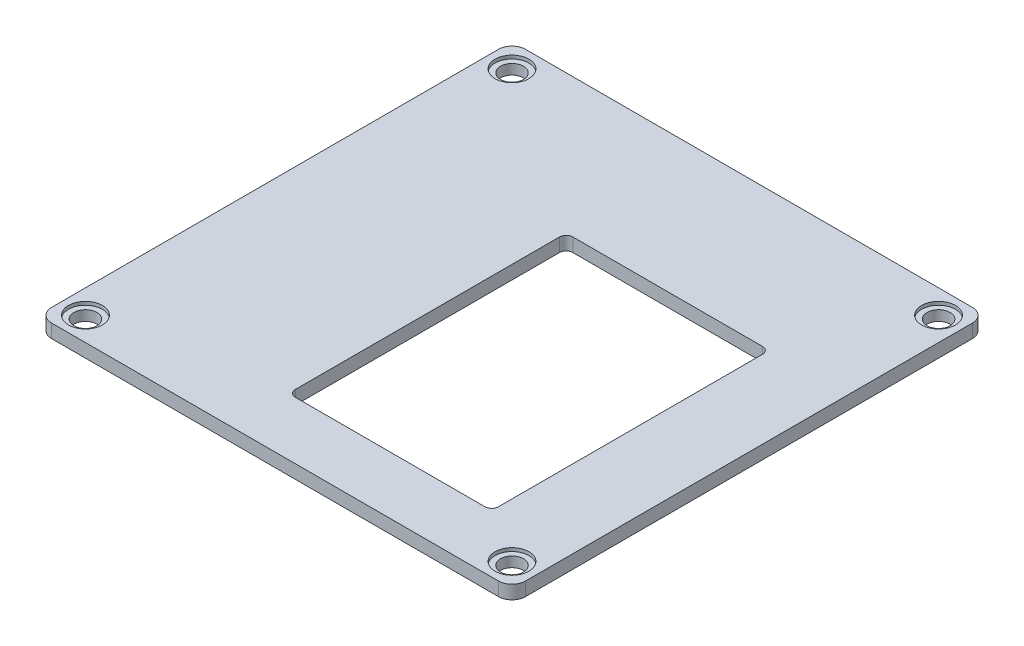
ISO-10303-21;
HEADER;
FILE_DESCRIPTION(('STEP AP214'),'2;1');
FILE_NAME('part.step','',(''),(''),'','','');
FILE_SCHEMA(('AUTOMOTIVE_DESIGN { 1 0 10303 214 1 1 1 1 }'));
ENDSEC;
DATA;
#1=APPLICATION_CONTEXT('core data for automotive mechanical design processes');
#2=APPLICATION_PROTOCOL_DEFINITION('international standard','automotive_design',2000,#1);
#3=PRODUCT_CONTEXT('',#1,'mechanical');
#4=PRODUCT('Part','Part','',(#3));
#5=PRODUCT_RELATED_PRODUCT_CATEGORY('part','',(#4));
#6=PRODUCT_DEFINITION_FORMATION('','',#4);
#7=PRODUCT_DEFINITION_CONTEXT('part definition',#1,'design');
#8=PRODUCT_DEFINITION('design','',#6,#7);
#9=PRODUCT_DEFINITION_SHAPE('','',#8);
#10=(LENGTH_UNIT() NAMED_UNIT(*) SI_UNIT(.MILLI.,.METRE.));
#11=(NAMED_UNIT(*) PLANE_ANGLE_UNIT() SI_UNIT($,.RADIAN.));
#12=(NAMED_UNIT(*) SI_UNIT($,.STERADIAN.) SOLID_ANGLE_UNIT());
#13=UNCERTAINTY_MEASURE_WITH_UNIT(LENGTH_MEASURE(1.E-05),#10,'distance_accuracy_value','');
#14=(GEOMETRIC_REPRESENTATION_CONTEXT(3) GLOBAL_UNCERTAINTY_ASSIGNED_CONTEXT((#13)) GLOBAL_UNIT_ASSIGNED_CONTEXT((#10,
#11,#12)) REPRESENTATION_CONTEXT('',''));
#15=CARTESIAN_POINT('',(0.,0.,0.));
#16=DIRECTION('',(0.,0.,1.));
#17=DIRECTION('',(1.,0.,0.));
#18=AXIS2_PLACEMENT_3D('',#15,#16,#17);
#19=CARTESIAN_POINT('',(28.,2.,28.));
#20=DIRECTION('',(0.,-1.,0.));
#21=DIRECTION('',(0.,0.,-1.));
#22=AXIS2_PLACEMENT_3D('',#19,#20,#21);
#23=CYLINDRICAL_SURFACE('',#22,1.7);
#24=CARTESIAN_POINT('',(28.,0.,28.));
#25=DIRECTION('',(0.,1.,0.));
#26=DIRECTION('',(0.,0.,1.));
#27=AXIS2_PLACEMENT_3D('',#24,#25,#26);
#28=CIRCLE('',#27,1.7);
#29=CARTESIAN_POINT('',(28.,0.,29.7));
#30=VERTEX_POINT('',#29);
#31=EDGE_CURVE('E191',#30,#30,#28,.T.);
#32=ORIENTED_EDGE('',*,*,#31,.F.);
#33=EDGE_LOOP('',(#32));
#34=FACE_BOUND('',#33,.T.);
#35=CARTESIAN_POINT('',(28.,1.5,28.));
#36=DIRECTION('',(0.,1.,0.));
#37=DIRECTION('',(0.,0.,1.));
#38=AXIS2_PLACEMENT_3D('',#35,#36,#37);
#39=CIRCLE('',#38,1.7);
#40=CARTESIAN_POINT('',(28.,1.5,29.7));
#41=VERTEX_POINT('',#40);
#42=EDGE_CURVE('E658',#41,#41,#39,.F.);
#43=ORIENTED_EDGE('',*,*,#42,.F.);
#44=EDGE_LOOP('',(#43));
#45=FACE_BOUND('',#44,.T.);
#46=ADVANCED_FACE('F39',(#34,#45),#23,.F.);
#47=CARTESIAN_POINT('',(28.,2.,-35.));
#48=DIRECTION('',(0.,-1.,0.));
#49=DIRECTION('',(0.,0.,-1.));
#50=AXIS2_PLACEMENT_3D('',#47,#48,#49);
#51=CYLINDRICAL_SURFACE('',#50,1.7);
#52=CARTESIAN_POINT('',(28.,0.,-35.));
#53=DIRECTION('',(0.,1.,0.));
#54=DIRECTION('',(0.,0.,1.));
#55=AXIS2_PLACEMENT_3D('',#52,#53,#54);
#56=CIRCLE('',#55,1.7);
#57=CARTESIAN_POINT('',(28.,0.,-33.3));
#58=VERTEX_POINT('',#57);
#59=EDGE_CURVE('E338',#58,#58,#56,.T.);
#60=ORIENTED_EDGE('',*,*,#59,.F.);
#61=EDGE_LOOP('',(#60));
#62=FACE_BOUND('',#61,.T.);
#63=CARTESIAN_POINT('',(28.,1.5,-35.));
#64=DIRECTION('',(0.,1.,0.));
#65=DIRECTION('',(0.,0.,1.));
#66=AXIS2_PLACEMENT_3D('',#63,#64,#65);
#67=CIRCLE('',#66,1.7);
#68=CARTESIAN_POINT('',(28.,1.5,-33.3));
#69=VERTEX_POINT('',#68);
#70=EDGE_CURVE('E645',#69,#69,#67,.F.);
#71=ORIENTED_EDGE('',*,*,#70,.F.);
#72=EDGE_LOOP('',(#71));
#73=FACE_BOUND('',#72,.T.);
#74=ADVANCED_FACE('F391',(#62,#73),#51,.F.);
#75=CARTESIAN_POINT('',(-35.,2.,28.));
#76=DIRECTION('',(0.,-1.,0.));
#77=DIRECTION('',(0.,0.,-1.));
#78=AXIS2_PLACEMENT_3D('',#75,#76,#77);
#79=CYLINDRICAL_SURFACE('',#78,1.7);
#80=CARTESIAN_POINT('',(-35.,0.,28.));
#81=DIRECTION('',(0.,1.,0.));
#82=DIRECTION('',(0.,0.,-1.));
#83=AXIS2_PLACEMENT_3D('',#80,#81,#82);
#84=CIRCLE('',#83,1.7);
#85=CARTESIAN_POINT('',(-35.,0.,26.3));
#86=VERTEX_POINT('',#85);
#87=EDGE_CURVE('E334',#86,#86,#84,.T.);
#88=ORIENTED_EDGE('',*,*,#87,.F.);
#89=EDGE_LOOP('',(#88));
#90=FACE_BOUND('',#89,.T.);
#91=CARTESIAN_POINT('',(-35.,1.5,28.));
#92=DIRECTION('',(0.,1.,0.));
#93=DIRECTION('',(0.,0.,1.));
#94=AXIS2_PLACEMENT_3D('',#91,#92,#93);
#95=CIRCLE('',#94,1.7);
#96=CARTESIAN_POINT('',(-35.,1.5,29.7));
#97=VERTEX_POINT('',#96);
#98=EDGE_CURVE('E615',#97,#97,#95,.F.);
#99=ORIENTED_EDGE('',*,*,#98,.F.);
#100=EDGE_LOOP('',(#99));
#101=FACE_BOUND('',#100,.T.);
#102=ADVANCED_FACE('F397',(#90,#101),#79,.F.);
#103=CARTESIAN_POINT('',(-35.,2.,-35.));
#104=DIRECTION('',(0.,-1.,0.));
#105=DIRECTION('',(0.,0.,-1.));
#106=AXIS2_PLACEMENT_3D('',#103,#104,#105);
#107=CYLINDRICAL_SURFACE('',#106,1.7);
#108=CARTESIAN_POINT('',(-35.,0.,-35.));
#109=DIRECTION('',(0.,1.,0.));
#110=DIRECTION('',(0.,0.,-1.));
#111=AXIS2_PLACEMENT_3D('',#108,#109,#110);
#112=CIRCLE('',#111,1.7);
#113=CARTESIAN_POINT('',(-35.,0.,-36.7));
#114=VERTEX_POINT('',#113);
#115=EDGE_CURVE('E324',#114,#114,#112,.T.);
#116=ORIENTED_EDGE('',*,*,#115,.F.);
#117=EDGE_LOOP('',(#116));
#118=FACE_BOUND('',#117,.T.);
#119=CARTESIAN_POINT('',(-35.,1.5,-35.));
#120=DIRECTION('',(0.,1.,0.));
#121=DIRECTION('',(0.,0.,1.));
#122=AXIS2_PLACEMENT_3D('',#119,#120,#121);
#123=CIRCLE('',#122,1.7);
#124=CARTESIAN_POINT('',(-35.,1.5,-33.3));
#125=VERTEX_POINT('',#124);
#126=EDGE_CURVE('E630',#125,#125,#123,.F.);
#127=ORIENTED_EDGE('',*,*,#126,.F.);
#128=EDGE_LOOP('',(#127));
#129=FACE_BOUND('',#128,.T.);
#130=ADVANCED_FACE('F406',(#118,#129),#107,.F.);
#131=CARTESIAN_POINT('',(0.,2.,0.));
#132=DIRECTION('',(0.,1.,0.));
#133=DIRECTION('',(0.,0.,1.));
#134=AXIS2_PLACEMENT_3D('',#131,#132,#133);
#135=PLANE('',#134);
#136=CARTESIAN_POINT('',(-35.,2.,28.));
#137=DIRECTION('',(0.,1.,0.));
#138=DIRECTION('',(0.,0.,1.));
#139=AXIS2_PLACEMENT_3D('',#136,#137,#138);
#140=CIRCLE('',#139,2.5);
#141=CARTESIAN_POINT('',(-35.,2.,30.5));
#142=VERTEX_POINT('',#141);
#143=EDGE_CURVE('E618',#142,#142,#140,.T.);
#144=ORIENTED_EDGE('',*,*,#143,.F.);
#145=EDGE_LOOP('',(#144));
#146=FACE_BOUND('',#145,.T.);
#147=CARTESIAN_POINT('',(28.,2.,28.));
#148=DIRECTION('',(0.,1.,0.));
#149=DIRECTION('',(0.,0.,1.));
#150=AXIS2_PLACEMENT_3D('',#147,#148,#149);
#151=CIRCLE('',#150,2.5);
#152=CARTESIAN_POINT('',(28.,2.,30.5));
#153=VERTEX_POINT('',#152);
#154=EDGE_CURVE('E623',#153,#153,#151,.T.);
#155=ORIENTED_EDGE('',*,*,#154,.F.);
#156=EDGE_LOOP('',(#155));
#157=FACE_BOUND('',#156,.T.);
#158=CARTESIAN_POINT('',(28.,2.,-35.));
#159=DIRECTION('',(0.,1.,0.));
#160=DIRECTION('',(0.,0.,1.));
#161=AXIS2_PLACEMENT_3D('',#158,#159,#160);
#162=CIRCLE('',#161,2.5);
#163=CARTESIAN_POINT('',(28.,2.,-32.5));
#164=VERTEX_POINT('',#163);
#165=EDGE_CURVE('E651',#164,#164,#162,.T.);
#166=ORIENTED_EDGE('',*,*,#165,.F.);
#167=EDGE_LOOP('',(#166));
#168=FACE_BOUND('',#167,.T.);
#169=CARTESIAN_POINT('',(-35.,2.,-35.));
#170=DIRECTION('',(0.,1.,0.));
#171=DIRECTION('',(0.,0.,1.));
#172=AXIS2_PLACEMENT_3D('',#169,#170,#171);
#173=CIRCLE('',#172,2.5);
#174=CARTESIAN_POINT('',(-35.,2.,-32.5));
#175=VERTEX_POINT('',#174);
#176=EDGE_CURVE('E314',#175,#175,#173,.T.);
#177=ORIENTED_EDGE('',*,*,#176,.F.);
#178=EDGE_LOOP('',(#177));
#179=FACE_BOUND('',#178,.T.);
#180=DIRECTION('',(0.,0.,1.));
#181=VECTOR('',#180,1.);
#182=CARTESIAN_POINT('',(-38.5,2.,-38.5));
#183=LINE('',#182,#181);
#184=CARTESIAN_POINT('',(-38.5,2.,-36.5));
#185=VERTEX_POINT('',#184);
#186=CARTESIAN_POINT('',(-38.5,2.,29.5));
#187=VERTEX_POINT('',#186);
#188=EDGE_CURVE('E198',#185,#187,#183,.T.);
#189=ORIENTED_EDGE('',*,*,#188,.T.);
#190=CARTESIAN_POINT('',(-36.5,2.,29.5));
#191=DIRECTION('',(0.,1.,0.));
#192=DIRECTION('',(0.,0.,1.));
#193=AXIS2_PLACEMENT_3D('',#190,#191,#192);
#194=CIRCLE('',#193,2.);
#195=CARTESIAN_POINT('',(-36.5,2.,31.5));
#196=VERTEX_POINT('',#195);
#197=EDGE_CURVE('E223',#187,#196,#194,.T.);
#198=ORIENTED_EDGE('',*,*,#197,.T.);
#199=DIRECTION('',(1.,0.,0.));
#200=VECTOR('',#199,1.);
#201=CARTESIAN_POINT('',(-38.5,2.,31.5));
#202=LINE('',#201,#200);
#203=CARTESIAN_POINT('',(29.5,2.,31.5));
#204=VERTEX_POINT('',#203);
#205=EDGE_CURVE('E174',#196,#204,#202,.T.);
#206=ORIENTED_EDGE('',*,*,#205,.T.);
#207=CARTESIAN_POINT('',(29.5,2.,29.5));
#208=DIRECTION('',(0.,1.,0.));
#209=DIRECTION('',(0.,0.,1.));
#210=AXIS2_PLACEMENT_3D('',#207,#208,#209);
#211=CIRCLE('',#210,2.);
#212=CARTESIAN_POINT('',(31.5,2.,29.5));
#213=VERTEX_POINT('',#212);
#214=EDGE_CURVE('E220',#204,#213,#211,.T.);
#215=ORIENTED_EDGE('',*,*,#214,.T.);
#216=DIRECTION('',(0.,0.,-1.));
#217=VECTOR('',#216,1.);
#218=CARTESIAN_POINT('',(31.5,2.,-38.5));
#219=LINE('',#218,#217);
#220=CARTESIAN_POINT('',(31.5,2.,-36.5));
#221=VERTEX_POINT('',#220);
#222=EDGE_CURVE('E350',#213,#221,#219,.T.);
#223=ORIENTED_EDGE('',*,*,#222,.T.);
#224=CARTESIAN_POINT('',(29.5,2.,-36.5));
#225=DIRECTION('',(0.,1.,0.));
#226=DIRECTION('',(0.,0.,1.));
#227=AXIS2_PLACEMENT_3D('',#224,#225,#226);
#228=CIRCLE('',#227,2.);
#229=CARTESIAN_POINT('',(29.5,2.,-38.5));
#230=VERTEX_POINT('',#229);
#231=EDGE_CURVE('E217',#221,#230,#228,.T.);
#232=ORIENTED_EDGE('',*,*,#231,.T.);
#233=DIRECTION('',(-1.,0.,0.));
#234=VECTOR('',#233,1.);
#235=CARTESIAN_POINT('',(-38.5,2.,-38.5));
#236=LINE('',#235,#234);
#237=CARTESIAN_POINT('',(-36.5,2.,-38.5));
#238=VERTEX_POINT('',#237);
#239=EDGE_CURVE('E200',#230,#238,#236,.T.);
#240=ORIENTED_EDGE('',*,*,#239,.T.);
#241=CARTESIAN_POINT('',(-36.5,2.,-36.5));
#242=DIRECTION('',(0.,1.,0.));
#243=DIRECTION('',(0.,0.,1.));
#244=AXIS2_PLACEMENT_3D('',#241,#242,#243);
#245=CIRCLE('',#244,2.);
#246=EDGE_CURVE('E214',#238,#185,#245,.T.);
#247=ORIENTED_EDGE('',*,*,#246,.T.);
#248=EDGE_LOOP('',(#189,#198,#206,#215,#223,#232,#240,#247));
#249=FACE_BOUND('',#248,.T.);
#250=DIRECTION('',(1.,0.,0.));
#251=VECTOR('',#250,1.);
#252=CARTESIAN_POINT('',(-10.,2.,23.));
#253=LINE('',#252,#251);
#254=CARTESIAN_POINT('',(-9.,2.,23.));
#255=VERTEX_POINT('',#254);
#256=CARTESIAN_POINT('',(19.,2.,23.));
#257=VERTEX_POINT('',#256);
#258=EDGE_CURVE('E305',#255,#257,#253,.T.);
#259=ORIENTED_EDGE('',*,*,#258,.F.);
#260=CARTESIAN_POINT('',(-9.,2.,22.));
#261=DIRECTION('',(0.,1.,0.));
#262=DIRECTION('',(0.,0.,1.));
#263=AXIS2_PLACEMENT_3D('',#260,#261,#262);
#264=CIRCLE('',#263,1.);
#265=CARTESIAN_POINT('',(-10.,2.,22.));
#266=VERTEX_POINT('',#265);
#267=EDGE_CURVE('E11',#255,#266,#264,.F.);
#268=ORIENTED_EDGE('',*,*,#267,.T.);
#269=DIRECTION('',(0.,0.,1.));
#270=VECTOR('',#269,1.);
#271=CARTESIAN_POINT('',(-10.,2.,-18.));
#272=LINE('',#271,#270);
#273=CARTESIAN_POINT('',(-10.,2.,-17.));
#274=VERTEX_POINT('',#273);
#275=EDGE_CURVE('E302',#274,#266,#272,.T.);
#276=ORIENTED_EDGE('',*,*,#275,.F.);
#277=CARTESIAN_POINT('',(-9.00000000000001,2.,-17.));
#278=DIRECTION('',(0.,1.,0.));
#279=DIRECTION('',(0.,0.,1.));
#280=AXIS2_PLACEMENT_3D('',#277,#278,#279);
#281=CIRCLE('',#280,1.);
#282=CARTESIAN_POINT('',(-9.00000000000001,2.,-18.));
#283=VERTEX_POINT('',#282);
#284=EDGE_CURVE('E282',#274,#283,#281,.F.);
#285=ORIENTED_EDGE('',*,*,#284,.T.);
#286=DIRECTION('',(-1.,0.,0.));
#287=VECTOR('',#286,1.);
#288=CARTESIAN_POINT('',(-10.,2.,-18.));
#289=LINE('',#288,#287);
#290=CARTESIAN_POINT('',(19.,2.,-18.));
#291=VERTEX_POINT('',#290);
#292=EDGE_CURVE('E320',#291,#283,#289,.T.);
#293=ORIENTED_EDGE('',*,*,#292,.F.);
#294=CARTESIAN_POINT('',(19.,2.,-17.));
#295=DIRECTION('',(0.,1.,0.));
#296=DIRECTION('',(0.,0.,1.));
#297=AXIS2_PLACEMENT_3D('',#294,#295,#296);
#298=CIRCLE('',#297,1.);
#299=CARTESIAN_POINT('',(20.,2.,-17.));
#300=VERTEX_POINT('',#299);
#301=EDGE_CURVE('E270',#291,#300,#298,.F.);
#302=ORIENTED_EDGE('',*,*,#301,.T.);
#303=DIRECTION('',(0.,0.,-1.));
#304=VECTOR('',#303,1.);
#305=CARTESIAN_POINT('',(20.,2.,-18.));
#306=LINE('',#305,#304);
#307=CARTESIAN_POINT('',(20.,2.,22.));
#308=VERTEX_POINT('',#307);
#309=EDGE_CURVE('E310',#308,#300,#306,.T.);
#310=ORIENTED_EDGE('',*,*,#309,.F.);
#311=CARTESIAN_POINT('',(19.,2.,22.));
#312=DIRECTION('',(0.,1.,0.));
#313=DIRECTION('',(0.,0.,1.));
#314=AXIS2_PLACEMENT_3D('',#311,#312,#313);
#315=CIRCLE('',#314,1.);
#316=EDGE_CURVE('E276',#308,#257,#315,.F.);
#317=ORIENTED_EDGE('',*,*,#316,.T.);
#318=EDGE_LOOP('',(#259,#268,#276,#285,#293,#302,#310,#317));
#319=FACE_BOUND('',#318,.T.);
#320=ADVANCED_FACE('F358',(#146,#157,#168,#179,#249,#319),#135,.T.);
#321=CARTESIAN_POINT('',(0.,0.,0.));
#322=DIRECTION('',(0.,1.,0.));
#323=DIRECTION('',(0.,0.,1.));
#324=AXIS2_PLACEMENT_3D('',#321,#322,#323);
#325=PLANE('',#324);
#326=ORIENTED_EDGE('',*,*,#115,.T.);
#327=EDGE_LOOP('',(#326));
#328=FACE_BOUND('',#327,.T.);
#329=ORIENTED_EDGE('',*,*,#87,.T.);
#330=EDGE_LOOP('',(#329));
#331=FACE_BOUND('',#330,.T.);
#332=ORIENTED_EDGE('',*,*,#59,.T.);
#333=EDGE_LOOP('',(#332));
#334=FACE_BOUND('',#333,.T.);
#335=ORIENTED_EDGE('',*,*,#31,.T.);
#336=EDGE_LOOP('',(#335));
#337=FACE_BOUND('',#336,.T.);
#338=DIRECTION('',(1.,0.,0.));
#339=VECTOR('',#338,1.);
#340=CARTESIAN_POINT('',(-38.5,0.,31.5));
#341=LINE('',#340,#339);
#342=CARTESIAN_POINT('',(-36.5,0.,31.5));
#343=VERTEX_POINT('',#342);
#344=CARTESIAN_POINT('',(29.5,0.,31.5));
#345=VERTEX_POINT('',#344);
#346=EDGE_CURVE('E171',#343,#345,#341,.T.);
#347=ORIENTED_EDGE('',*,*,#346,.F.);
#348=CARTESIAN_POINT('',(-36.5,0.,29.5));
#349=DIRECTION('',(0.,1.,0.));
#350=DIRECTION('',(0.,0.,1.));
#351=AXIS2_PLACEMENT_3D('',#348,#349,#350);
#352=CIRCLE('',#351,2.);
#353=CARTESIAN_POINT('',(-38.5,0.,29.5));
#354=VERTEX_POINT('',#353);
#355=EDGE_CURVE('E153',#343,#354,#352,.F.);
#356=ORIENTED_EDGE('',*,*,#355,.T.);
#357=DIRECTION('',(0.,0.,1.));
#358=VECTOR('',#357,1.);
#359=CARTESIAN_POINT('',(-38.5,0.,-38.5));
#360=LINE('',#359,#358);
#361=CARTESIAN_POINT('',(-38.5,0.,-36.5));
#362=VERTEX_POINT('',#361);
#363=EDGE_CURVE('E184',#362,#354,#360,.T.);
#364=ORIENTED_EDGE('',*,*,#363,.F.);
#365=CARTESIAN_POINT('',(-36.5,0.,-36.5));
#366=DIRECTION('',(0.,1.,0.));
#367=DIRECTION('',(0.,0.,1.));
#368=AXIS2_PLACEMENT_3D('',#365,#366,#367);
#369=CIRCLE('',#368,2.);
#370=CARTESIAN_POINT('',(-36.5,0.,-38.5));
#371=VERTEX_POINT('',#370);
#372=EDGE_CURVE('E176',#362,#371,#369,.F.);
#373=ORIENTED_EDGE('',*,*,#372,.T.);
#374=DIRECTION('',(-1.,0.,0.));
#375=VECTOR('',#374,1.);
#376=CARTESIAN_POINT('',(-38.5,0.,-38.5));
#377=LINE('',#376,#375);
#378=CARTESIAN_POINT('',(29.5,0.,-38.5));
#379=VERTEX_POINT('',#378);
#380=EDGE_CURVE('E189',#379,#371,#377,.T.);
#381=ORIENTED_EDGE('',*,*,#380,.F.);
#382=CARTESIAN_POINT('',(29.5,0.,-36.5));
#383=DIRECTION('',(0.,1.,0.));
#384=DIRECTION('',(0.,0.,1.));
#385=AXIS2_PLACEMENT_3D('',#382,#383,#384);
#386=CIRCLE('',#385,2.);
#387=CARTESIAN_POINT('',(31.5,0.,-36.5));
#388=VERTEX_POINT('',#387);
#389=EDGE_CURVE('E204',#379,#388,#386,.F.);
#390=ORIENTED_EDGE('',*,*,#389,.T.);
#391=DIRECTION('',(0.,0.,-1.));
#392=VECTOR('',#391,1.);
#393=CARTESIAN_POINT('',(31.5,0.,-38.5));
#394=LINE('',#393,#392);
#395=CARTESIAN_POINT('',(31.5,0.,29.5));
#396=VERTEX_POINT('',#395);
#397=EDGE_CURVE('E183',#396,#388,#394,.T.);
#398=ORIENTED_EDGE('',*,*,#397,.F.);
#399=CARTESIAN_POINT('',(29.5,0.,29.5));
#400=DIRECTION('',(0.,1.,0.));
#401=DIRECTION('',(0.,0.,1.));
#402=AXIS2_PLACEMENT_3D('',#399,#400,#401);
#403=CIRCLE('',#402,2.);
#404=EDGE_CURVE('E165',#396,#345,#403,.F.);
#405=ORIENTED_EDGE('',*,*,#404,.T.);
#406=EDGE_LOOP('',(#347,#356,#364,#373,#381,#390,#398,#405));
#407=FACE_BOUND('',#406,.T.);
#408=DIRECTION('',(-1.,0.,0.));
#409=VECTOR('',#408,1.);
#410=CARTESIAN_POINT('',(-10.,0.,-18.));
#411=LINE('',#410,#409);
#412=CARTESIAN_POINT('',(19.,0.,-18.));
#413=VERTEX_POINT('',#412);
#414=CARTESIAN_POINT('',(-9.00000000000001,0.,-18.));
#415=VERTEX_POINT('',#414);
#416=EDGE_CURVE('E306',#413,#415,#411,.T.);
#417=ORIENTED_EDGE('',*,*,#416,.T.);
#418=CARTESIAN_POINT('',(-9.00000000000001,0.,-17.));
#419=DIRECTION('',(0.,1.,0.));
#420=DIRECTION('',(0.,0.,1.));
#421=AXIS2_PLACEMENT_3D('',#418,#419,#420);
#422=CIRCLE('',#421,1.);
#423=CARTESIAN_POINT('',(-10.,0.,-17.));
#424=VERTEX_POINT('',#423);
#425=EDGE_CURVE('E279',#415,#424,#422,.T.);
#426=ORIENTED_EDGE('',*,*,#425,.T.);
#427=DIRECTION('',(0.,0.,1.));
#428=VECTOR('',#427,1.);
#429=CARTESIAN_POINT('',(-10.,0.,-18.));
#430=LINE('',#429,#428);
#431=CARTESIAN_POINT('',(-10.,0.,22.));
#432=VERTEX_POINT('',#431);
#433=EDGE_CURVE('E290',#424,#432,#430,.T.);
#434=ORIENTED_EDGE('',*,*,#433,.T.);
#435=CARTESIAN_POINT('',(-9.,0.,22.));
#436=DIRECTION('',(0.,1.,0.));
#437=DIRECTION('',(0.,0.,1.));
#438=AXIS2_PLACEMENT_3D('',#435,#436,#437);
#439=CIRCLE('',#438,1.);
#440=CARTESIAN_POINT('',(-9.,0.,23.));
#441=VERTEX_POINT('',#440);
#442=EDGE_CURVE('E48',#432,#441,#439,.T.);
#443=ORIENTED_EDGE('',*,*,#442,.T.);
#444=DIRECTION('',(1.,0.,0.));
#445=VECTOR('',#444,1.);
#446=CARTESIAN_POINT('',(-10.,0.,23.));
#447=LINE('',#446,#445);
#448=CARTESIAN_POINT('',(19.,0.,23.));
#449=VERTEX_POINT('',#448);
#450=EDGE_CURVE('E289',#441,#449,#447,.T.);
#451=ORIENTED_EDGE('',*,*,#450,.T.);
#452=CARTESIAN_POINT('',(19.,0.,22.));
#453=DIRECTION('',(0.,1.,0.));
#454=DIRECTION('',(0.,0.,1.));
#455=AXIS2_PLACEMENT_3D('',#452,#453,#454);
#456=CIRCLE('',#455,1.);
#457=CARTESIAN_POINT('',(20.,0.,22.));
#458=VERTEX_POINT('',#457);
#459=EDGE_CURVE('E273',#449,#458,#456,.T.);
#460=ORIENTED_EDGE('',*,*,#459,.T.);
#461=DIRECTION('',(0.,0.,-1.));
#462=VECTOR('',#461,1.);
#463=CARTESIAN_POINT('',(20.,0.,-18.));
#464=LINE('',#463,#462);
#465=CARTESIAN_POINT('',(20.,0.,-17.));
#466=VERTEX_POINT('',#465);
#467=EDGE_CURVE('E299',#458,#466,#464,.T.);
#468=ORIENTED_EDGE('',*,*,#467,.T.);
#469=CARTESIAN_POINT('',(19.,0.,-17.));
#470=DIRECTION('',(0.,1.,0.));
#471=DIRECTION('',(0.,0.,1.));
#472=AXIS2_PLACEMENT_3D('',#469,#470,#471);
#473=CIRCLE('',#472,1.);
#474=EDGE_CURVE('E267',#466,#413,#473,.T.);
#475=ORIENTED_EDGE('',*,*,#474,.T.);
#476=EDGE_LOOP('',(#417,#426,#434,#443,#451,#460,#468,#475));
#477=FACE_BOUND('',#476,.T.);
#478=ADVANCED_FACE('F179',(#328,#331,#334,#337,#407,#477),#325,.F.);
#479=CARTESIAN_POINT('',(-38.5,2.,-38.5));
#480=DIRECTION('',(1.,0.,0.));
#481=DIRECTION('',(0.,0.,-1.));
#482=AXIS2_PLACEMENT_3D('',#479,#480,#481);
#483=PLANE('',#482);
#484=ORIENTED_EDGE('',*,*,#363,.T.);
#485=DIRECTION('',(0.,-1.,0.));
#486=VECTOR('',#485,1.);
#487=CARTESIAN_POINT('',(-38.5,2.,29.5));
#488=LINE('',#487,#486);
#489=EDGE_CURVE('E158',#354,#187,#488,.F.);
#490=ORIENTED_EDGE('',*,*,#489,.T.);
#491=ORIENTED_EDGE('',*,*,#188,.F.);
#492=DIRECTION('',(0.,-1.,0.));
#493=VECTOR('',#492,1.);
#494=CARTESIAN_POINT('',(-38.5,2.,-36.5));
#495=LINE('',#494,#493);
#496=EDGE_CURVE('E164',#185,#362,#495,.T.);
#497=ORIENTED_EDGE('',*,*,#496,.T.);
#498=EDGE_LOOP('',(#484,#490,#491,#497));
#499=FACE_BOUND('',#498,.T.);
#500=ADVANCED_FACE('F368',(#499),#483,.F.);
#501=CARTESIAN_POINT('',(-38.5,2.,31.5));
#502=DIRECTION('',(0.,0.,-1.));
#503=DIRECTION('',(-1.,0.,0.));
#504=AXIS2_PLACEMENT_3D('',#501,#502,#503);
#505=PLANE('',#504);
#506=ORIENTED_EDGE('',*,*,#205,.F.);
#507=DIRECTION('',(0.,-1.,0.));
#508=VECTOR('',#507,1.);
#509=CARTESIAN_POINT('',(-36.5,2.,31.5));
#510=LINE('',#509,#508);
#511=EDGE_CURVE('E157',#196,#343,#510,.T.);
#512=ORIENTED_EDGE('',*,*,#511,.T.);
#513=ORIENTED_EDGE('',*,*,#346,.T.);
#514=DIRECTION('',(0.,-1.,0.));
#515=VECTOR('',#514,1.);
#516=CARTESIAN_POINT('',(29.5,2.,31.5));
#517=LINE('',#516,#515);
#518=EDGE_CURVE('E177',#345,#204,#517,.F.);
#519=ORIENTED_EDGE('',*,*,#518,.T.);
#520=EDGE_LOOP('',(#506,#512,#513,#519));
#521=FACE_BOUND('',#520,.T.);
#522=ADVANCED_FACE('F170',(#521),#505,.F.);
#523=CARTESIAN_POINT('',(31.5,2.,-38.5));
#524=DIRECTION('',(-1.,0.,0.));
#525=DIRECTION('',(0.,0.,1.));
#526=AXIS2_PLACEMENT_3D('',#523,#524,#525);
#527=PLANE('',#526);
#528=ORIENTED_EDGE('',*,*,#222,.F.);
#529=DIRECTION('',(0.,-1.,0.));
#530=VECTOR('',#529,1.);
#531=CARTESIAN_POINT('',(31.5,2.,29.5));
#532=LINE('',#531,#530);
#533=EDGE_CURVE('E229',#213,#396,#532,.T.);
#534=ORIENTED_EDGE('',*,*,#533,.T.);
#535=ORIENTED_EDGE('',*,*,#397,.T.);
#536=DIRECTION('',(0.,-1.,0.));
#537=VECTOR('',#536,1.);
#538=CARTESIAN_POINT('',(31.5,2.,-36.5));
#539=LINE('',#538,#537);
#540=EDGE_CURVE('E226',#388,#221,#539,.F.);
#541=ORIENTED_EDGE('',*,*,#540,.T.);
#542=EDGE_LOOP('',(#528,#534,#535,#541));
#543=FACE_BOUND('',#542,.T.);
#544=ADVANCED_FACE('F376',(#543),#527,.F.);
#545=CARTESIAN_POINT('',(-38.5,2.,-38.5));
#546=DIRECTION('',(0.,0.,1.));
#547=DIRECTION('',(1.,0.,0.));
#548=AXIS2_PLACEMENT_3D('',#545,#546,#547);
#549=PLANE('',#548);
#550=ORIENTED_EDGE('',*,*,#239,.F.);
#551=DIRECTION('',(0.,-1.,0.));
#552=VECTOR('',#551,1.);
#553=CARTESIAN_POINT('',(29.5,2.,-38.5));
#554=LINE('',#553,#552);
#555=EDGE_CURVE('E236',#230,#379,#554,.T.);
#556=ORIENTED_EDGE('',*,*,#555,.T.);
#557=ORIENTED_EDGE('',*,*,#380,.T.);
#558=DIRECTION('',(0.,-1.,0.));
#559=VECTOR('',#558,1.);
#560=CARTESIAN_POINT('',(-36.5,2.,-38.5));
#561=LINE('',#560,#559);
#562=EDGE_CURVE('E233',#371,#238,#561,.F.);
#563=ORIENTED_EDGE('',*,*,#562,.T.);
#564=EDGE_LOOP('',(#550,#556,#557,#563));
#565=FACE_BOUND('',#564,.T.);
#566=ADVANCED_FACE('F370',(#565),#549,.F.);
#567=CARTESIAN_POINT('',(-10.,2.,-18.));
#568=DIRECTION('',(1.,0.,0.));
#569=DIRECTION('',(0.,0.,-1.));
#570=AXIS2_PLACEMENT_3D('',#567,#568,#569);
#571=PLANE('',#570);
#572=ORIENTED_EDGE('',*,*,#433,.F.);
#573=DIRECTION('',(0.,-1.,0.));
#574=VECTOR('',#573,1.);
#575=CARTESIAN_POINT('',(-10.,2.,-17.));
#576=LINE('',#575,#574);
#577=EDGE_CURVE('E60',#424,#274,#576,.F.);
#578=ORIENTED_EDGE('',*,*,#577,.T.);
#579=ORIENTED_EDGE('',*,*,#275,.T.);
#580=DIRECTION('',(0.,-1.,0.));
#581=VECTOR('',#580,1.);
#582=CARTESIAN_POINT('',(-10.,0.,22.));
#583=LINE('',#582,#581);
#584=EDGE_CURVE('E261',#266,#432,#583,.T.);
#585=ORIENTED_EDGE('',*,*,#584,.T.);
#586=EDGE_LOOP('',(#572,#578,#579,#585));
#587=FACE_BOUND('',#586,.T.);
#588=ADVANCED_FACE('F301',(#587),#571,.T.);
#589=CARTESIAN_POINT('',(-10.,2.,23.));
#590=DIRECTION('',(0.,0.,-1.));
#591=DIRECTION('',(-1.,0.,0.));
#592=AXIS2_PLACEMENT_3D('',#589,#590,#591);
#593=PLANE('',#592);
#594=ORIENTED_EDGE('',*,*,#258,.T.);
#595=DIRECTION('',(0.,-1.,0.));
#596=VECTOR('',#595,1.);
#597=CARTESIAN_POINT('',(19.,0.,23.));
#598=LINE('',#597,#596);
#599=EDGE_CURVE('E257',#257,#449,#598,.T.);
#600=ORIENTED_EDGE('',*,*,#599,.T.);
#601=ORIENTED_EDGE('',*,*,#450,.F.);
#602=DIRECTION('',(0.,-1.,0.));
#603=VECTOR('',#602,1.);
#604=CARTESIAN_POINT('',(-9.,2.,23.));
#605=LINE('',#604,#603);
#606=EDGE_CURVE('E254',#441,#255,#605,.F.);
#607=ORIENTED_EDGE('',*,*,#606,.T.);
#608=EDGE_LOOP('',(#594,#600,#601,#607));
#609=FACE_BOUND('',#608,.T.);
#610=ADVANCED_FACE('F296',(#609),#593,.T.);
#611=CARTESIAN_POINT('',(20.,2.,-18.));
#612=DIRECTION('',(-1.,0.,0.));
#613=DIRECTION('',(0.,0.,1.));
#614=AXIS2_PLACEMENT_3D('',#611,#612,#613);
#615=PLANE('',#614);
#616=ORIENTED_EDGE('',*,*,#309,.T.);
#617=DIRECTION('',(0.,-1.,0.));
#618=VECTOR('',#617,1.);
#619=CARTESIAN_POINT('',(20.,0.,-17.));
#620=LINE('',#619,#618);
#621=EDGE_CURVE('E243',#300,#466,#620,.T.);
#622=ORIENTED_EDGE('',*,*,#621,.T.);
#623=ORIENTED_EDGE('',*,*,#467,.F.);
#624=DIRECTION('',(0.,-1.,0.));
#625=VECTOR('',#624,1.);
#626=CARTESIAN_POINT('',(20.,2.,22.));
#627=LINE('',#626,#625);
#628=EDGE_CURVE('E240',#458,#308,#627,.F.);
#629=ORIENTED_EDGE('',*,*,#628,.T.);
#630=EDGE_LOOP('',(#616,#622,#623,#629));
#631=FACE_BOUND('',#630,.T.);
#632=ADVANCED_FACE('F447',(#631),#615,.T.);
#633=CARTESIAN_POINT('',(-10.,2.,-18.));
#634=DIRECTION('',(0.,0.,1.));
#635=DIRECTION('',(1.,0.,0.));
#636=AXIS2_PLACEMENT_3D('',#633,#634,#635);
#637=PLANE('',#636);
#638=ORIENTED_EDGE('',*,*,#416,.F.);
#639=DIRECTION('',(0.,-1.,0.));
#640=VECTOR('',#639,1.);
#641=CARTESIAN_POINT('',(19.,2.,-18.));
#642=LINE('',#641,#640);
#643=EDGE_CURVE('E251',#413,#291,#642,.F.);
#644=ORIENTED_EDGE('',*,*,#643,.T.);
#645=ORIENTED_EDGE('',*,*,#292,.T.);
#646=DIRECTION('',(0.,-1.,0.));
#647=VECTOR('',#646,1.);
#648=CARTESIAN_POINT('',(-9.00000000000001,0.,-18.));
#649=LINE('',#648,#647);
#650=EDGE_CURVE('E247',#283,#415,#649,.T.);
#651=ORIENTED_EDGE('',*,*,#650,.T.);
#652=EDGE_LOOP('',(#638,#644,#645,#651));
#653=FACE_BOUND('',#652,.T.);
#654=ADVANCED_FACE('F388',(#653),#637,.T.);
#655=CARTESIAN_POINT('',(-36.5,2.,29.5));
#656=DIRECTION('',(0.,-1.,0.));
#657=DIRECTION('',(0.,0.,-1.));
#658=AXIS2_PLACEMENT_3D('',#655,#656,#657);
#659=CYLINDRICAL_SURFACE('',#658,2.);
#660=ORIENTED_EDGE('',*,*,#197,.F.);
#661=ORIENTED_EDGE('',*,*,#489,.F.);
#662=ORIENTED_EDGE('',*,*,#355,.F.);
#663=ORIENTED_EDGE('',*,*,#511,.F.);
#664=EDGE_LOOP('',(#660,#661,#662,#663));
#665=FACE_BOUND('',#664,.T.);
#666=ADVANCED_FACE('F156',(#665),#659,.T.);
#667=CARTESIAN_POINT('',(29.5,2.,29.5));
#668=DIRECTION('',(0.,-1.,0.));
#669=DIRECTION('',(0.,0.,-1.));
#670=AXIS2_PLACEMENT_3D('',#667,#668,#669);
#671=CYLINDRICAL_SURFACE('',#670,2.);
#672=ORIENTED_EDGE('',*,*,#214,.F.);
#673=ORIENTED_EDGE('',*,*,#518,.F.);
#674=ORIENTED_EDGE('',*,*,#404,.F.);
#675=ORIENTED_EDGE('',*,*,#533,.F.);
#676=EDGE_LOOP('',(#672,#673,#674,#675));
#677=FACE_BOUND('',#676,.T.);
#678=ADVANCED_FACE('F380',(#677),#671,.T.);
#679=CARTESIAN_POINT('',(29.5,2.,-36.5));
#680=DIRECTION('',(0.,-1.,0.));
#681=DIRECTION('',(0.,0.,-1.));
#682=AXIS2_PLACEMENT_3D('',#679,#680,#681);
#683=CYLINDRICAL_SURFACE('',#682,2.);
#684=ORIENTED_EDGE('',*,*,#231,.F.);
#685=ORIENTED_EDGE('',*,*,#540,.F.);
#686=ORIENTED_EDGE('',*,*,#389,.F.);
#687=ORIENTED_EDGE('',*,*,#555,.F.);
#688=EDGE_LOOP('',(#684,#685,#686,#687));
#689=FACE_BOUND('',#688,.T.);
#690=ADVANCED_FACE('F372',(#689),#683,.T.);
#691=CARTESIAN_POINT('',(-36.5,2.,-36.5));
#692=DIRECTION('',(0.,-1.,0.));
#693=DIRECTION('',(0.,0.,-1.));
#694=AXIS2_PLACEMENT_3D('',#691,#692,#693);
#695=CYLINDRICAL_SURFACE('',#694,2.);
#696=ORIENTED_EDGE('',*,*,#246,.F.);
#697=ORIENTED_EDGE('',*,*,#562,.F.);
#698=ORIENTED_EDGE('',*,*,#372,.F.);
#699=ORIENTED_EDGE('',*,*,#496,.F.);
#700=EDGE_LOOP('',(#696,#697,#698,#699));
#701=FACE_BOUND('',#700,.T.);
#702=ADVANCED_FACE('F366',(#701),#695,.T.);
#703=CARTESIAN_POINT('',(19.,2.,-17.));
#704=DIRECTION('',(0.,1.,0.));
#705=DIRECTION('',(0.,0.,1.));
#706=AXIS2_PLACEMENT_3D('',#703,#704,#705);
#707=CYLINDRICAL_SURFACE('',#706,1.);
#708=ORIENTED_EDGE('',*,*,#301,.F.);
#709=ORIENTED_EDGE('',*,*,#643,.F.);
#710=ORIENTED_EDGE('',*,*,#474,.F.);
#711=ORIENTED_EDGE('',*,*,#621,.F.);
#712=EDGE_LOOP('',(#708,#709,#710,#711));
#713=FACE_BOUND('',#712,.T.);
#714=ADVANCED_FACE('F484',(#713),#707,.F.);
#715=CARTESIAN_POINT('',(19.,2.,22.));
#716=DIRECTION('',(0.,1.,0.));
#717=DIRECTION('',(0.,0.,1.));
#718=AXIS2_PLACEMENT_3D('',#715,#716,#717);
#719=CYLINDRICAL_SURFACE('',#718,1.);
#720=ORIENTED_EDGE('',*,*,#316,.F.);
#721=ORIENTED_EDGE('',*,*,#628,.F.);
#722=ORIENTED_EDGE('',*,*,#459,.F.);
#723=ORIENTED_EDGE('',*,*,#599,.F.);
#724=EDGE_LOOP('',(#720,#721,#722,#723));
#725=FACE_BOUND('',#724,.T.);
#726=ADVANCED_FACE('F708',(#725),#719,.F.);
#727=CARTESIAN_POINT('',(-9.00000000000001,2.,-17.));
#728=DIRECTION('',(0.,1.,0.));
#729=DIRECTION('',(0.,0.,1.));
#730=AXIS2_PLACEMENT_3D('',#727,#728,#729);
#731=CYLINDRICAL_SURFACE('',#730,1.);
#732=ORIENTED_EDGE('',*,*,#284,.F.);
#733=ORIENTED_EDGE('',*,*,#577,.F.);
#734=ORIENTED_EDGE('',*,*,#425,.F.);
#735=ORIENTED_EDGE('',*,*,#650,.F.);
#736=EDGE_LOOP('',(#732,#733,#734,#735));
#737=FACE_BOUND('',#736,.T.);
#738=ADVANCED_FACE('F700',(#737),#731,.F.);
#739=CARTESIAN_POINT('',(-9.,2.,22.));
#740=DIRECTION('',(0.,1.,0.));
#741=DIRECTION('',(0.,0.,1.));
#742=AXIS2_PLACEMENT_3D('',#739,#740,#741);
#743=CYLINDRICAL_SURFACE('',#742,1.);
#744=ORIENTED_EDGE('',*,*,#267,.F.);
#745=ORIENTED_EDGE('',*,*,#606,.F.);
#746=ORIENTED_EDGE('',*,*,#442,.F.);
#747=ORIENTED_EDGE('',*,*,#584,.F.);
#748=EDGE_LOOP('',(#744,#745,#746,#747));
#749=FACE_BOUND('',#748,.T.);
#750=ADVANCED_FACE('F41',(#749),#743,.F.);
#751=CARTESIAN_POINT('',(-35.,1.5,-35.));
#752=DIRECTION('',(0.,1.,0.));
#753=DIRECTION('',(0.,0.,1.));
#754=AXIS2_PLACEMENT_3D('',#751,#752,#753);
#755=CYLINDRICAL_SURFACE('',#754,2.5);
#756=CARTESIAN_POINT('',(-35.,1.5,-35.));
#757=DIRECTION('',(0.,1.,0.));
#758=DIRECTION('',(0.,0.,1.));
#759=AXIS2_PLACEMENT_3D('',#756,#757,#758);
#760=CIRCLE('',#759,2.5);
#761=CARTESIAN_POINT('',(-35.,1.5,-32.5));
#762=VERTEX_POINT('',#761);
#763=EDGE_CURVE('E326',#762,#762,#760,.T.);
#764=ORIENTED_EDGE('',*,*,#763,.F.);
#765=EDGE_LOOP('',(#764));
#766=FACE_BOUND('',#765,.T.);
#767=ORIENTED_EDGE('',*,*,#176,.T.);
#768=EDGE_LOOP('',(#767));
#769=FACE_BOUND('',#768,.T.);
#770=ADVANCED_FACE('F523',(#766,#769),#755,.F.);
#771=CARTESIAN_POINT('',(0.,1.5,0.));
#772=DIRECTION('',(0.,1.,0.));
#773=DIRECTION('',(0.,0.,1.));
#774=AXIS2_PLACEMENT_3D('',#771,#772,#773);
#775=PLANE('',#774);
#776=ORIENTED_EDGE('',*,*,#126,.T.);
#777=EDGE_LOOP('',(#776));
#778=FACE_BOUND('',#777,.T.);
#779=ORIENTED_EDGE('',*,*,#763,.T.);
#780=EDGE_LOOP('',(#779));
#781=FACE_BOUND('',#780,.T.);
#782=ADVANCED_FACE('F528',(#778,#781),#775,.T.);
#783=CARTESIAN_POINT('',(-35.,1.5,28.));
#784=DIRECTION('',(0.,1.,0.));
#785=DIRECTION('',(0.,0.,1.));
#786=AXIS2_PLACEMENT_3D('',#783,#784,#785);
#787=CYLINDRICAL_SURFACE('',#786,2.5);
#788=CARTESIAN_POINT('',(-35.,1.5,28.));
#789=DIRECTION('',(0.,1.,0.));
#790=DIRECTION('',(0.,0.,1.));
#791=AXIS2_PLACEMENT_3D('',#788,#789,#790);
#792=CIRCLE('',#791,2.5);
#793=CARTESIAN_POINT('',(-35.,1.5,30.5));
#794=VERTEX_POINT('',#793);
#795=EDGE_CURVE('E617',#794,#794,#792,.T.);
#796=ORIENTED_EDGE('',*,*,#795,.F.);
#797=EDGE_LOOP('',(#796));
#798=FACE_BOUND('',#797,.T.);
#799=ORIENTED_EDGE('',*,*,#143,.T.);
#800=EDGE_LOOP('',(#799));
#801=FACE_BOUND('',#800,.T.);
#802=ADVANCED_FACE('F540',(#798,#801),#787,.F.);
#803=CARTESIAN_POINT('',(0.,1.5,0.));
#804=DIRECTION('',(0.,1.,0.));
#805=DIRECTION('',(0.,0.,1.));
#806=AXIS2_PLACEMENT_3D('',#803,#804,#805);
#807=PLANE('',#806);
#808=ORIENTED_EDGE('',*,*,#98,.T.);
#809=EDGE_LOOP('',(#808));
#810=FACE_BOUND('',#809,.T.);
#811=ORIENTED_EDGE('',*,*,#795,.T.);
#812=EDGE_LOOP('',(#811));
#813=FACE_BOUND('',#812,.T.);
#814=ADVANCED_FACE('F550',(#810,#813),#807,.T.);
#815=CARTESIAN_POINT('',(28.,1.5,-35.));
#816=DIRECTION('',(0.,1.,0.));
#817=DIRECTION('',(0.,0.,1.));
#818=AXIS2_PLACEMENT_3D('',#815,#816,#817);
#819=CYLINDRICAL_SURFACE('',#818,2.5);
#820=CARTESIAN_POINT('',(28.,1.5,-35.));
#821=DIRECTION('',(0.,1.,0.));
#822=DIRECTION('',(0.,0.,1.));
#823=AXIS2_PLACEMENT_3D('',#820,#821,#822);
#824=CIRCLE('',#823,2.5);
#825=CARTESIAN_POINT('',(28.,1.5,-32.5));
#826=VERTEX_POINT('',#825);
#827=EDGE_CURVE('E642',#826,#826,#824,.T.);
#828=ORIENTED_EDGE('',*,*,#827,.F.);
#829=EDGE_LOOP('',(#828));
#830=FACE_BOUND('',#829,.T.);
#831=ORIENTED_EDGE('',*,*,#165,.T.);
#832=EDGE_LOOP('',(#831));
#833=FACE_BOUND('',#832,.T.);
#834=ADVANCED_FACE('F560',(#830,#833),#819,.F.);
#835=CARTESIAN_POINT('',(0.,1.5,0.));
#836=DIRECTION('',(0.,1.,0.));
#837=DIRECTION('',(0.,0.,1.));
#838=AXIS2_PLACEMENT_3D('',#835,#836,#837);
#839=PLANE('',#838);
#840=ORIENTED_EDGE('',*,*,#70,.T.);
#841=EDGE_LOOP('',(#840));
#842=FACE_BOUND('',#841,.T.);
#843=ORIENTED_EDGE('',*,*,#827,.T.);
#844=EDGE_LOOP('',(#843));
#845=FACE_BOUND('',#844,.T.);
#846=ADVANCED_FACE('F570',(#842,#845),#839,.T.);
#847=CARTESIAN_POINT('',(28.,1.5,28.));
#848=DIRECTION('',(0.,1.,0.));
#849=DIRECTION('',(0.,0.,1.));
#850=AXIS2_PLACEMENT_3D('',#847,#848,#849);
#851=CYLINDRICAL_SURFACE('',#850,2.5);
#852=CARTESIAN_POINT('',(28.,1.5,28.));
#853=DIRECTION('',(0.,1.,0.));
#854=DIRECTION('',(0.,0.,1.));
#855=AXIS2_PLACEMENT_3D('',#852,#853,#854);
#856=CIRCLE('',#855,2.5);
#857=CARTESIAN_POINT('',(28.,1.5,30.5));
#858=VERTEX_POINT('',#857);
#859=EDGE_CURVE('E657',#858,#858,#856,.T.);
#860=ORIENTED_EDGE('',*,*,#859,.F.);
#861=EDGE_LOOP('',(#860));
#862=FACE_BOUND('',#861,.T.);
#863=ORIENTED_EDGE('',*,*,#154,.T.);
#864=EDGE_LOOP('',(#863));
#865=FACE_BOUND('',#864,.T.);
#866=ADVANCED_FACE('F580',(#862,#865),#851,.F.);
#867=CARTESIAN_POINT('',(0.,1.5,0.));
#868=DIRECTION('',(0.,1.,0.));
#869=DIRECTION('',(0.,0.,1.));
#870=AXIS2_PLACEMENT_3D('',#867,#868,#869);
#871=PLANE('',#870);
#872=ORIENTED_EDGE('',*,*,#42,.T.);
#873=EDGE_LOOP('',(#872));
#874=FACE_BOUND('',#873,.T.);
#875=ORIENTED_EDGE('',*,*,#859,.T.);
#876=EDGE_LOOP('',(#875));
#877=FACE_BOUND('',#876,.T.);
#878=ADVANCED_FACE('F590',(#874,#877),#871,.T.);
#879=CLOSED_SHELL('',(#46,#74,#102,#130,#320,#478,#500,#522,#544,#566,#588,#610,#632,#654,#666,
#678,#690,#702,#714,#726,#738,#750,#770,#782,#802,#814,#834,#846,#866,#878));
#880=MANIFOLD_SOLID_BREP('B2',#879);
#881=ADVANCED_BREP_SHAPE_REPRESENTATION('',(#18,#880),#14);
#882=SHAPE_DEFINITION_REPRESENTATION(#9,#881);
ENDSEC;
END-ISO-10303-21;
